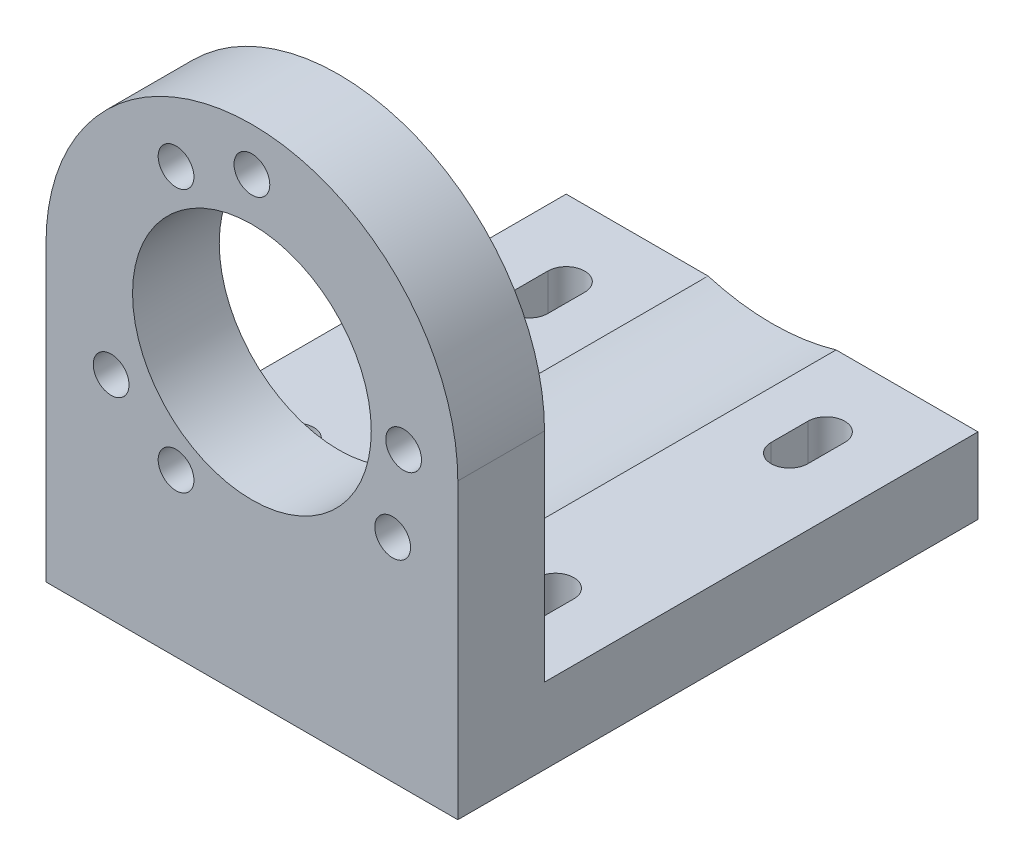
ISO-10303-21;
HEADER;
FILE_DESCRIPTION(('STEP AP214'),'2;1');
FILE_NAME('part.step','',(''),(''),'','','');
FILE_SCHEMA(('AUTOMOTIVE_DESIGN { 1 0 10303 214 1 1 1 1 }'));
ENDSEC;
DATA;
#1=APPLICATION_CONTEXT('core data for automotive mechanical design processes');
#2=APPLICATION_PROTOCOL_DEFINITION('international standard','automotive_design',2000,#1);
#3=PRODUCT_CONTEXT('',#1,'mechanical');
#4=PRODUCT('Part','Part','',(#3));
#5=PRODUCT_RELATED_PRODUCT_CATEGORY('part','',(#4));
#6=PRODUCT_DEFINITION_FORMATION('','',#4);
#7=PRODUCT_DEFINITION_CONTEXT('part definition',#1,'design');
#8=PRODUCT_DEFINITION('design','',#6,#7);
#9=PRODUCT_DEFINITION_SHAPE('','',#8);
#10=(LENGTH_UNIT() NAMED_UNIT(*) SI_UNIT(.MILLI.,.METRE.));
#11=(NAMED_UNIT(*) PLANE_ANGLE_UNIT() SI_UNIT($,.RADIAN.));
#12=(NAMED_UNIT(*) SI_UNIT($,.STERADIAN.) SOLID_ANGLE_UNIT());
#13=UNCERTAINTY_MEASURE_WITH_UNIT(LENGTH_MEASURE(1.E-05),#10,'distance_accuracy_value','');
#14=(GEOMETRIC_REPRESENTATION_CONTEXT(3) GLOBAL_UNCERTAINTY_ASSIGNED_CONTEXT((#13)) GLOBAL_UNIT_ASSIGNED_CONTEXT((#10,
#11,#12)) REPRESENTATION_CONTEXT('',''));
#15=CARTESIAN_POINT('',(0.,0.,0.));
#16=DIRECTION('',(0.,0.,1.));
#17=DIRECTION('',(1.,0.,0.));
#18=AXIS2_PLACEMENT_3D('',#15,#16,#17);
#19=CARTESIAN_POINT('',(0.,-20.0729490596628,0.));
#20=DIRECTION('',(0.,1.,0.));
#21=DIRECTION('',(0.,0.,1.));
#22=AXIS2_PLACEMENT_3D('',#19,#20,#21);
#23=PLANE('',#22);
#24=CARTESIAN_POINT('',(-12.,-20.0729490596628,-33.0063812149838));
#25=DIRECTION('',(0.,1.,0.));
#26=DIRECTION('',(0.,0.,1.));
#27=AXIS2_PLACEMENT_3D('',#24,#25,#26);
#28=CIRCLE('',#27,1.7);
#29=CARTESIAN_POINT('',(-10.3,-20.0729490596628,-33.0063812149838));
#30=VERTEX_POINT('',#29);
#31=CARTESIAN_POINT('',(-13.7,-20.0729490596628,-33.0063812149838));
#32=VERTEX_POINT('',#31);
#33=EDGE_CURVE('E55',#30,#32,#28,.T.);
#34=ORIENTED_EDGE('',*,*,#33,.F.);
#35=DIRECTION('',(0.,0.,-1.));
#36=VECTOR('',#35,1.);
#37=CARTESIAN_POINT('',(-10.3,-20.0729490596628,-33.0063812149838));
#38=LINE('',#37,#36);
#39=CARTESIAN_POINT('',(-10.3,-20.0729490596628,-29.6063812149838));
#40=VERTEX_POINT('',#39);
#41=EDGE_CURVE('E226',#40,#30,#38,.T.);
#42=ORIENTED_EDGE('',*,*,#41,.F.);
#43=CARTESIAN_POINT('',(-12.,-20.0729490596628,-29.6063812149838));
#44=DIRECTION('',(0.,1.,0.));
#45=DIRECTION('',(0.,0.,1.));
#46=AXIS2_PLACEMENT_3D('',#43,#44,#45);
#47=CIRCLE('',#46,1.7);
#48=CARTESIAN_POINT('',(-13.7,-20.0729490596628,-29.6063812149838));
#49=VERTEX_POINT('',#48);
#50=EDGE_CURVE('E208',#49,#40,#47,.T.);
#51=ORIENTED_EDGE('',*,*,#50,.F.);
#52=DIRECTION('',(0.,0.,1.));
#53=VECTOR('',#52,1.);
#54=CARTESIAN_POINT('',(-13.7,-20.0729490596628,-33.0063812149838));
#55=LINE('',#54,#53);
#56=EDGE_CURVE('E219',#32,#49,#55,.T.);
#57=ORIENTED_EDGE('',*,*,#56,.F.);
#58=EDGE_LOOP('',(#34,#42,#51,#57));
#59=FACE_BOUND('',#58,.T.);
#60=CARTESIAN_POINT('',(-12.,-20.0729490596628,-8.00638121498381));
#61=DIRECTION('',(0.,1.,0.));
#62=DIRECTION('',(0.,0.,1.));
#63=AXIS2_PLACEMENT_3D('',#60,#61,#62);
#64=CIRCLE('',#63,1.7);
#65=CARTESIAN_POINT('',(-10.3,-20.0729490596628,-8.00638121498381));
#66=VERTEX_POINT('',#65);
#67=CARTESIAN_POINT('',(-13.7,-20.0729490596628,-8.00638121498381));
#68=VERTEX_POINT('',#67);
#69=EDGE_CURVE('E63',#66,#68,#64,.T.);
#70=ORIENTED_EDGE('',*,*,#69,.F.);
#71=DIRECTION('',(0.,0.,-1.));
#72=VECTOR('',#71,1.);
#73=CARTESIAN_POINT('',(-10.3,-20.0729490596628,-8.00638121498381));
#74=LINE('',#73,#72);
#75=CARTESIAN_POINT('',(-10.3,-20.0729490596628,-4.60638121498382));
#76=VERTEX_POINT('',#75);
#77=EDGE_CURVE('E306',#76,#66,#74,.T.);
#78=ORIENTED_EDGE('',*,*,#77,.F.);
#79=CARTESIAN_POINT('',(-12.,-20.0729490596628,-4.60638121498382));
#80=DIRECTION('',(0.,1.,0.));
#81=DIRECTION('',(0.,0.,1.));
#82=AXIS2_PLACEMENT_3D('',#79,#80,#81);
#83=CIRCLE('',#82,1.7);
#84=CARTESIAN_POINT('',(-13.7,-20.0729490596628,-4.60638121498382));
#85=VERTEX_POINT('',#84);
#86=EDGE_CURVE('E302',#85,#76,#83,.T.);
#87=ORIENTED_EDGE('',*,*,#86,.F.);
#88=DIRECTION('',(0.,0.,1.));
#89=VECTOR('',#88,1.);
#90=CARTESIAN_POINT('',(-13.7,-20.0729490596628,-8.00638121498381));
#91=LINE('',#90,#89);
#92=EDGE_CURVE('E298',#68,#85,#91,.T.);
#93=ORIENTED_EDGE('',*,*,#92,.F.);
#94=EDGE_LOOP('',(#70,#78,#87,#93));
#95=FACE_BOUND('',#94,.T.);
#96=DIRECTION('',(-1.,0.,0.));
#97=VECTOR('',#96,1.);
#98=CARTESIAN_POINT('',(0.,-20.0729490596628,0.));
#99=LINE('',#98,#97);
#100=CARTESIAN_POINT('',(-5.90439898314019,-20.0729490596628,0.));
#101=VERTEX_POINT('',#100);
#102=CARTESIAN_POINT('',(-19.,-20.0729490596628,0.));
#103=VERTEX_POINT('',#102);
#104=EDGE_CURVE('E365',#101,#103,#99,.T.);
#105=ORIENTED_EDGE('',*,*,#104,.F.);
#106=DIRECTION('',(0.,0.,1.));
#107=VECTOR('',#106,1.);
#108=CARTESIAN_POINT('',(-5.90439898314019,-20.0729490596628,-51.));
#109=LINE('',#108,#107);
#110=CARTESIAN_POINT('',(-5.90439898314019,-20.0729490596628,-40.));
#111=VERTEX_POINT('',#110);
#112=EDGE_CURVE('E330',#111,#101,#109,.T.);
#113=ORIENTED_EDGE('',*,*,#112,.F.);
#114=DIRECTION('',(1.,0.,0.));
#115=VECTOR('',#114,1.);
#116=CARTESIAN_POINT('',(19.,-20.0729490596628,-40.));
#117=LINE('',#116,#115);
#118=CARTESIAN_POINT('',(-19.,-20.0729490596628,-40.));
#119=VERTEX_POINT('',#118);
#120=EDGE_CURVE('E357',#119,#111,#117,.T.);
#121=ORIENTED_EDGE('',*,*,#120,.F.);
#122=DIRECTION('',(0.,0.,-1.));
#123=VECTOR('',#122,1.);
#124=CARTESIAN_POINT('',(-19.,-20.0729490596628,8.));
#125=LINE('',#124,#123);
#126=EDGE_CURVE('E353',#103,#119,#125,.T.);
#127=ORIENTED_EDGE('',*,*,#126,.F.);
#128=EDGE_LOOP('',(#105,#113,#121,#127));
#129=FACE_BOUND('',#128,.T.);
#130=ADVANCED_FACE('F39',(#59,#95,#129),#23,.T.);
#131=CARTESIAN_POINT('',(12.,-20.0729490596628,-8.00638121498381));
#132=DIRECTION('',(0.,1.,0.));
#133=DIRECTION('',(0.,0.,1.));
#134=AXIS2_PLACEMENT_3D('',#131,#132,#133);
#135=CIRCLE('',#134,1.7);
#136=CARTESIAN_POINT('',(13.7,-20.0729490596628,-8.00638121498381));
#137=VERTEX_POINT('',#136);
#138=CARTESIAN_POINT('',(10.3,-20.0729490596628,-8.00638121498381));
#139=VERTEX_POINT('',#138);
#140=EDGE_CURVE('E269',#137,#139,#135,.T.);
#141=ORIENTED_EDGE('',*,*,#140,.F.);
#142=DIRECTION('',(0.,0.,-1.));
#143=VECTOR('',#142,1.);
#144=CARTESIAN_POINT('',(13.7,-20.0729490596628,-8.00638121498381));
#145=LINE('',#144,#143);
#146=CARTESIAN_POINT('',(13.7,-20.0729490596628,-4.60638121498382));
#147=VERTEX_POINT('',#146);
#148=EDGE_CURVE('E280',#147,#137,#145,.T.);
#149=ORIENTED_EDGE('',*,*,#148,.F.);
#150=CARTESIAN_POINT('',(12.,-20.0729490596628,-4.60638121498382));
#151=DIRECTION('',(0.,1.,0.));
#152=DIRECTION('',(0.,0.,1.));
#153=AXIS2_PLACEMENT_3D('',#150,#151,#152);
#154=CIRCLE('',#153,1.7);
#155=CARTESIAN_POINT('',(10.3,-20.0729490596628,-4.60638121498382));
#156=VERTEX_POINT('',#155);
#157=EDGE_CURVE('E276',#156,#147,#154,.T.);
#158=ORIENTED_EDGE('',*,*,#157,.F.);
#159=DIRECTION('',(0.,0.,1.));
#160=VECTOR('',#159,1.);
#161=CARTESIAN_POINT('',(10.3,-20.0729490596628,-8.00638121498381));
#162=LINE('',#161,#160);
#163=EDGE_CURVE('E272',#139,#156,#162,.T.);
#164=ORIENTED_EDGE('',*,*,#163,.F.);
#165=EDGE_LOOP('',(#141,#149,#158,#164));
#166=FACE_BOUND('',#165,.T.);
#167=CARTESIAN_POINT('',(12.,-20.0729490596628,-33.0063812149838));
#168=DIRECTION('',(0.,1.,0.));
#169=DIRECTION('',(0.,0.,1.));
#170=AXIS2_PLACEMENT_3D('',#167,#168,#169);
#171=CIRCLE('',#170,1.7);
#172=CARTESIAN_POINT('',(13.7,-20.0729490596628,-33.0063812149838));
#173=VERTEX_POINT('',#172);
#174=CARTESIAN_POINT('',(10.3,-20.0729490596628,-33.0063812149838));
#175=VERTEX_POINT('',#174);
#176=EDGE_CURVE('E240',#173,#175,#171,.T.);
#177=ORIENTED_EDGE('',*,*,#176,.F.);
#178=DIRECTION('',(0.,0.,-1.));
#179=VECTOR('',#178,1.);
#180=CARTESIAN_POINT('',(13.7,-20.0729490596628,-33.0063812149838));
#181=LINE('',#180,#179);
#182=CARTESIAN_POINT('',(13.7,-20.0729490596628,-29.6063812149838));
#183=VERTEX_POINT('',#182);
#184=EDGE_CURVE('E252',#183,#173,#181,.T.);
#185=ORIENTED_EDGE('',*,*,#184,.F.);
#186=CARTESIAN_POINT('',(12.,-20.0729490596628,-29.6063812149838));
#187=DIRECTION('',(0.,1.,0.));
#188=DIRECTION('',(0.,0.,1.));
#189=AXIS2_PLACEMENT_3D('',#186,#187,#188);
#190=CIRCLE('',#189,1.7);
#191=CARTESIAN_POINT('',(10.3,-20.0729490596628,-29.6063812149838));
#192=VERTEX_POINT('',#191);
#193=EDGE_CURVE('E248',#192,#183,#190,.T.);
#194=ORIENTED_EDGE('',*,*,#193,.F.);
#195=DIRECTION('',(0.,0.,1.));
#196=VECTOR('',#195,1.);
#197=CARTESIAN_POINT('',(10.3,-20.0729490596628,-33.0063812149838));
#198=LINE('',#197,#196);
#199=EDGE_CURVE('E243',#175,#192,#198,.T.);
#200=ORIENTED_EDGE('',*,*,#199,.F.);
#201=EDGE_LOOP('',(#177,#185,#194,#200));
#202=FACE_BOUND('',#201,.T.);
#203=CARTESIAN_POINT('',(5.90439898314019,-20.0729490596628,-40.));
#204=VERTEX_POINT('',#203);
#205=CARTESIAN_POINT('',(19.,-20.0729490596628,-40.));
#206=VERTEX_POINT('',#205);
#207=EDGE_CURVE('E356',#204,#206,#117,.T.);
#208=ORIENTED_EDGE('',*,*,#207,.F.);
#209=DIRECTION('',(0.,0.,1.));
#210=VECTOR('',#209,1.);
#211=CARTESIAN_POINT('',(5.90439898314019,-20.0729490596628,-51.));
#212=LINE('',#211,#210);
#213=CARTESIAN_POINT('',(5.90439898314019,-20.0729490596628,0.));
#214=VERTEX_POINT('',#213);
#215=EDGE_CURVE('E326',#204,#214,#212,.T.);
#216=ORIENTED_EDGE('',*,*,#215,.T.);
#217=CARTESIAN_POINT('',(19.,-20.0729490596628,0.));
#218=VERTEX_POINT('',#217);
#219=EDGE_CURVE('E368',#218,#214,#99,.T.);
#220=ORIENTED_EDGE('',*,*,#219,.F.);
#221=DIRECTION('',(0.,0.,1.));
#222=VECTOR('',#221,1.);
#223=CARTESIAN_POINT('',(19.,-20.0729490596628,8.));
#224=LINE('',#223,#222);
#225=EDGE_CURVE('E349',#206,#218,#224,.T.);
#226=ORIENTED_EDGE('',*,*,#225,.F.);
#227=EDGE_LOOP('',(#208,#216,#220,#226));
#228=FACE_BOUND('',#227,.T.);
#229=ADVANCED_FACE('F530',(#166,#202,#228),#23,.T.);
#230=CARTESIAN_POINT('',(19.,-20.0729490596628,-40.));
#231=DIRECTION('',(0.,0.,-1.));
#232=DIRECTION('',(-1.,0.,0.));
#233=AXIS2_PLACEMENT_3D('',#230,#231,#232);
#234=PLANE('',#233);
#235=ORIENTED_EDGE('',*,*,#120,.T.);
#236=CARTESIAN_POINT('',(0.,0.,-40.));
#237=DIRECTION('',(0.,0.,-1.));
#238=DIRECTION('',(-1.,0.,0.));
#239=AXIS2_PLACEMENT_3D('',#236,#237,#238);
#240=CIRCLE('',#239,20.9233174067575);
#241=EDGE_CURVE('E457',#111,#204,#240,.F.);
#242=ORIENTED_EDGE('',*,*,#241,.T.);
#243=ORIENTED_EDGE('',*,*,#207,.T.);
#244=DIRECTION('',(0.,-1.,0.));
#245=VECTOR('',#244,1.);
#246=CARTESIAN_POINT('',(19.,-20.0729490596628,-40.));
#247=LINE('',#246,#245);
#248=CARTESIAN_POINT('',(19.,-27.0729490596628,-40.));
#249=VERTEX_POINT('',#248);
#250=EDGE_CURVE('E362',#206,#249,#247,.T.);
#251=ORIENTED_EDGE('',*,*,#250,.T.);
#252=DIRECTION('',(1.,0.,0.));
#253=VECTOR('',#252,1.);
#254=CARTESIAN_POINT('',(19.,-27.0729490596628,-40.));
#255=LINE('',#254,#253);
#256=CARTESIAN_POINT('',(-19.,-27.0729490596628,-40.));
#257=VERTEX_POINT('',#256);
#258=EDGE_CURVE('E345',#257,#249,#255,.T.);
#259=ORIENTED_EDGE('',*,*,#258,.F.);
#260=DIRECTION('',(0.,-1.,0.));
#261=VECTOR('',#260,1.);
#262=CARTESIAN_POINT('',(-19.,-20.0729490596628,-40.));
#263=LINE('',#262,#261);
#264=EDGE_CURVE('E361',#119,#257,#263,.T.);
#265=ORIENTED_EDGE('',*,*,#264,.F.);
#266=EDGE_LOOP('',(#235,#242,#243,#251,#259,#265));
#267=FACE_BOUND('',#266,.T.);
#268=ADVANCED_FACE('F550',(#267),#234,.T.);
#269=CARTESIAN_POINT('',(0.,0.,8.));
#270=DIRECTION('',(0.,0.,1.));
#271=DIRECTION('',(1.,0.,0.));
#272=AXIS2_PLACEMENT_3D('',#269,#270,#271);
#273=PLANE('',#272);
#274=DIRECTION('',(0.,-1.,0.));
#275=VECTOR('',#274,1.);
#276=CARTESIAN_POINT('',(-19.,0.,8.));
#277=LINE('',#276,#275);
#278=CARTESIAN_POINT('',(-19.,0.,8.));
#279=VERTEX_POINT('',#278);
#280=CARTESIAN_POINT('',(-19.,-27.0729490596628,8.));
#281=VERTEX_POINT('',#280);
#282=EDGE_CURVE('E433',#279,#281,#277,.T.);
#283=ORIENTED_EDGE('',*,*,#282,.T.);
#284=DIRECTION('',(-1.,0.,0.));
#285=VECTOR('',#284,1.);
#286=CARTESIAN_POINT('',(19.,-27.0729490596628,8.));
#287=LINE('',#286,#285);
#288=CARTESIAN_POINT('',(19.,-27.0729490596628,8.));
#289=VERTEX_POINT('',#288);
#290=EDGE_CURVE('E337',#289,#281,#287,.T.);
#291=ORIENTED_EDGE('',*,*,#290,.F.);
#292=DIRECTION('',(0.,1.,0.));
#293=VECTOR('',#292,1.);
#294=CARTESIAN_POINT('',(19.,0.,8.));
#295=LINE('',#294,#293);
#296=CARTESIAN_POINT('',(19.,0.,8.));
#297=VERTEX_POINT('',#296);
#298=EDGE_CURVE('E437',#289,#297,#295,.T.);
#299=ORIENTED_EDGE('',*,*,#298,.T.);
#300=CARTESIAN_POINT('',(0.,0.,8.));
#301=DIRECTION('',(0.,0.,1.));
#302=DIRECTION('',(1.,0.,0.));
#303=AXIS2_PLACEMENT_3D('',#300,#301,#302);
#304=CIRCLE('',#303,19.);
#305=EDGE_CURVE('E429',#297,#279,#304,.T.);
#306=ORIENTED_EDGE('',*,*,#305,.T.);
#307=EDGE_LOOP('',(#283,#291,#299,#306));
#308=FACE_BOUND('',#307,.T.);
#309=CARTESIAN_POINT('',(0.,15.,8.));
#310=DIRECTION('',(0.,0.,1.));
#311=DIRECTION('',(1.,0.,0.));
#312=AXIS2_PLACEMENT_3D('',#309,#310,#311);
#313=CIRCLE('',#312,1.65);
#314=CARTESIAN_POINT('',(1.65,15.,8.));
#315=VERTEX_POINT('',#314);
#316=EDGE_CURVE('E381',#315,#315,#313,.T.);
#317=ORIENTED_EDGE('',*,*,#316,.F.);
#318=EDGE_LOOP('',(#317));
#319=FACE_BOUND('',#318,.T.);
#320=CARTESIAN_POINT('',(12.9903810567656,-7.50000000000172,8.));
#321=DIRECTION('',(0.,0.,1.));
#322=DIRECTION('',(1.,0.,0.));
#323=AXIS2_PLACEMENT_3D('',#320,#321,#322);
#324=CIRCLE('',#323,1.65);
#325=CARTESIAN_POINT('',(14.6403810567656,-7.50000000000172,8.));
#326=VERTEX_POINT('',#325);
#327=EDGE_CURVE('E397',#326,#326,#324,.T.);
#328=ORIENTED_EDGE('',*,*,#327,.F.);
#329=EDGE_LOOP('',(#328));
#330=FACE_BOUND('',#329,.T.);
#331=CARTESIAN_POINT('',(-7.00000000000088,-12.1243556529811,8.));
#332=DIRECTION('',(0.,0.,1.));
#333=DIRECTION('',(1.,0.,0.));
#334=AXIS2_PLACEMENT_3D('',#331,#332,#333);
#335=CIRCLE('',#334,1.64999999999999);
#336=CARTESIAN_POINT('',(-5.35000000000089,-12.1243556529811,8.));
#337=VERTEX_POINT('',#336);
#338=EDGE_CURVE('E413',#337,#337,#335,.T.);
#339=ORIENTED_EDGE('',*,*,#338,.F.);
#340=EDGE_LOOP('',(#339));
#341=FACE_BOUND('',#340,.T.);
#342=CARTESIAN_POINT('',(-12.9903810567686,-7.49999999999657,8.));
#343=DIRECTION('',(0.,0.,1.));
#344=DIRECTION('',(1.,0.,0.));
#345=AXIS2_PLACEMENT_3D('',#342,#343,#344);
#346=CIRCLE('',#345,1.65);
#347=CARTESIAN_POINT('',(-11.3403810567686,-7.49999999999657,8.));
#348=VERTEX_POINT('',#347);
#349=EDGE_CURVE('E421',#348,#348,#346,.T.);
#350=ORIENTED_EDGE('',*,*,#349,.F.);
#351=EDGE_LOOP('',(#350));
#352=FACE_BOUND('',#351,.T.);
#353=CARTESIAN_POINT('',(0.,0.,8.));
#354=DIRECTION('',(0.,0.,1.));
#355=DIRECTION('',(1.,0.,0.));
#356=AXIS2_PLACEMENT_3D('',#353,#354,#355);
#357=CIRCLE('',#356,11.0138861910663);
#358=CARTESIAN_POINT('',(11.0138861910663,0.,8.));
#359=VERTEX_POINT('',#358);
#360=EDGE_CURVE('E405',#359,#359,#357,.T.);
#361=ORIENTED_EDGE('',*,*,#360,.F.);
#362=EDGE_LOOP('',(#361));
#363=FACE_BOUND('',#362,.T.);
#364=CARTESIAN_POINT('',(14.0000000000009,-2.67147415300428E-13,8.));
#365=DIRECTION('',(0.,0.,1.));
#366=DIRECTION('',(1.,0.,0.));
#367=AXIS2_PLACEMENT_3D('',#364,#365,#366);
#368=CIRCLE('',#367,1.65);
#369=CARTESIAN_POINT('',(15.6500000000009,-2.67147415300428E-13,8.));
#370=VERTEX_POINT('',#369);
#371=EDGE_CURVE('E389',#370,#370,#368,.T.);
#372=ORIENTED_EDGE('',*,*,#371,.F.);
#373=EDGE_LOOP('',(#372));
#374=FACE_BOUND('',#373,.T.);
#375=CARTESIAN_POINT('',(-7.,12.1243556529822,8.));
#376=DIRECTION('',(0.,0.,1.));
#377=DIRECTION('',(1.,0.,0.));
#378=AXIS2_PLACEMENT_3D('',#375,#376,#377);
#379=CIRCLE('',#378,1.65000000000004);
#380=CARTESIAN_POINT('',(-5.34999999999997,12.1243556529822,8.));
#381=VERTEX_POINT('',#380);
#382=EDGE_CURVE('E373',#381,#381,#379,.T.);
#383=ORIENTED_EDGE('',*,*,#382,.F.);
#384=EDGE_LOOP('',(#383));
#385=FACE_BOUND('',#384,.T.);
#386=ADVANCED_FACE('F556',(#308,#319,#330,#341,#352,#363,#374,#385),#273,.T.);
#387=CARTESIAN_POINT('',(0.,0.,0.));
#388=DIRECTION('',(0.,0.,1.));
#389=DIRECTION('',(1.,0.,0.));
#390=AXIS2_PLACEMENT_3D('',#387,#388,#389);
#391=PLANE('',#390);
#392=DIRECTION('',(0.,1.,0.));
#393=VECTOR('',#392,1.);
#394=CARTESIAN_POINT('',(19.,0.,0.));
#395=LINE('',#394,#393);
#396=CARTESIAN_POINT('',(19.,0.,0.));
#397=VERTEX_POINT('',#396);
#398=EDGE_CURVE('E434',#218,#397,#395,.T.);
#399=ORIENTED_EDGE('',*,*,#398,.F.);
#400=ORIENTED_EDGE('',*,*,#219,.T.);
#401=CARTESIAN_POINT('',(0.,0.,0.));
#402=DIRECTION('',(0.,0.,-1.));
#403=DIRECTION('',(-1.,0.,0.));
#404=AXIS2_PLACEMENT_3D('',#401,#402,#403);
#405=CIRCLE('',#404,20.9233174067575);
#406=EDGE_CURVE('E314',#214,#101,#405,.T.);
#407=ORIENTED_EDGE('',*,*,#406,.T.);
#408=ORIENTED_EDGE('',*,*,#104,.T.);
#409=DIRECTION('',(0.,-1.,0.));
#410=VECTOR('',#409,1.);
#411=CARTESIAN_POINT('',(-19.,0.,0.));
#412=LINE('',#411,#410);
#413=CARTESIAN_POINT('',(-19.,0.,0.));
#414=VERTEX_POINT('',#413);
#415=EDGE_CURVE('E444',#414,#103,#412,.T.);
#416=ORIENTED_EDGE('',*,*,#415,.F.);
#417=CARTESIAN_POINT('',(0.,0.,0.));
#418=DIRECTION('',(0.,0.,1.));
#419=DIRECTION('',(1.,0.,0.));
#420=AXIS2_PLACEMENT_3D('',#417,#418,#419);
#421=CIRCLE('',#420,19.);
#422=EDGE_CURVE('E425',#397,#414,#421,.T.);
#423=ORIENTED_EDGE('',*,*,#422,.F.);
#424=EDGE_LOOP('',(#399,#400,#407,#408,#416,#423));
#425=FACE_BOUND('',#424,.T.);
#426=CARTESIAN_POINT('',(-12.9903810567686,-7.49999999999657,0.));
#427=DIRECTION('',(0.,0.,1.));
#428=DIRECTION('',(1.,0.,0.));
#429=AXIS2_PLACEMENT_3D('',#426,#427,#428);
#430=CIRCLE('',#429,1.65);
#431=CARTESIAN_POINT('',(-11.3403810567686,-7.49999999999657,0.));
#432=VERTEX_POINT('',#431);
#433=EDGE_CURVE('E417',#432,#432,#430,.T.);
#434=ORIENTED_EDGE('',*,*,#433,.T.);
#435=EDGE_LOOP('',(#434));
#436=FACE_BOUND('',#435,.T.);
#437=CARTESIAN_POINT('',(-7.00000000000088,-12.1243556529811,0.));
#438=DIRECTION('',(0.,0.,1.));
#439=DIRECTION('',(1.,0.,0.));
#440=AXIS2_PLACEMENT_3D('',#437,#438,#439);
#441=CIRCLE('',#440,1.64999999999999);
#442=CARTESIAN_POINT('',(-5.35000000000089,-12.1243556529811,0.));
#443=VERTEX_POINT('',#442);
#444=EDGE_CURVE('E409',#443,#443,#441,.T.);
#445=ORIENTED_EDGE('',*,*,#444,.T.);
#446=EDGE_LOOP('',(#445));
#447=FACE_BOUND('',#446,.T.);
#448=CARTESIAN_POINT('',(0.,0.,0.));
#449=DIRECTION('',(0.,0.,1.));
#450=DIRECTION('',(1.,0.,0.));
#451=AXIS2_PLACEMENT_3D('',#448,#449,#450);
#452=CIRCLE('',#451,11.0138861910663);
#453=CARTESIAN_POINT('',(11.0138861910663,0.,0.));
#454=VERTEX_POINT('',#453);
#455=EDGE_CURVE('E401',#454,#454,#452,.T.);
#456=ORIENTED_EDGE('',*,*,#455,.T.);
#457=EDGE_LOOP('',(#456));
#458=FACE_BOUND('',#457,.T.);
#459=CARTESIAN_POINT('',(12.9903810567656,-7.50000000000172,0.));
#460=DIRECTION('',(0.,0.,1.));
#461=DIRECTION('',(1.,0.,0.));
#462=AXIS2_PLACEMENT_3D('',#459,#460,#461);
#463=CIRCLE('',#462,1.65);
#464=CARTESIAN_POINT('',(14.6403810567656,-7.50000000000172,0.));
#465=VERTEX_POINT('',#464);
#466=EDGE_CURVE('E393',#465,#465,#463,.T.);
#467=ORIENTED_EDGE('',*,*,#466,.T.);
#468=EDGE_LOOP('',(#467));
#469=FACE_BOUND('',#468,.T.);
#470=CARTESIAN_POINT('',(14.0000000000009,-2.67147415300428E-13,0.));
#471=DIRECTION('',(0.,0.,1.));
#472=DIRECTION('',(1.,0.,0.));
#473=AXIS2_PLACEMENT_3D('',#470,#471,#472);
#474=CIRCLE('',#473,1.65);
#475=CARTESIAN_POINT('',(15.6500000000009,-2.67147415300428E-13,0.));
#476=VERTEX_POINT('',#475);
#477=EDGE_CURVE('E385',#476,#476,#474,.T.);
#478=ORIENTED_EDGE('',*,*,#477,.T.);
#479=EDGE_LOOP('',(#478));
#480=FACE_BOUND('',#479,.T.);
#481=CARTESIAN_POINT('',(0.,15.,0.));
#482=DIRECTION('',(0.,0.,1.));
#483=DIRECTION('',(1.,0.,0.));
#484=AXIS2_PLACEMENT_3D('',#481,#482,#483);
#485=CIRCLE('',#484,1.65);
#486=CARTESIAN_POINT('',(1.65,15.,0.));
#487=VERTEX_POINT('',#486);
#488=EDGE_CURVE('E377',#487,#487,#485,.T.);
#489=ORIENTED_EDGE('',*,*,#488,.T.);
#490=EDGE_LOOP('',(#489));
#491=FACE_BOUND('',#490,.T.);
#492=CARTESIAN_POINT('',(-7.,12.1243556529822,0.));
#493=DIRECTION('',(0.,0.,1.));
#494=DIRECTION('',(1.,0.,0.));
#495=AXIS2_PLACEMENT_3D('',#492,#493,#494);
#496=CIRCLE('',#495,1.65000000000004);
#497=CARTESIAN_POINT('',(-5.34999999999997,12.1243556529822,0.));
#498=VERTEX_POINT('',#497);
#499=EDGE_CURVE('E372',#498,#498,#496,.T.);
#500=ORIENTED_EDGE('',*,*,#499,.T.);
#501=EDGE_LOOP('',(#500));
#502=FACE_BOUND('',#501,.T.);
#503=ADVANCED_FACE('F588',(#425,#436,#447,#458,#469,#480,#491,#502),#391,.F.);
#504=CARTESIAN_POINT('',(0.,0.,8.));
#505=DIRECTION('',(0.,0.,-1.));
#506=DIRECTION('',(-1.,0.,0.));
#507=AXIS2_PLACEMENT_3D('',#504,#505,#506);
#508=CYLINDRICAL_SURFACE('',#507,19.);
#509=ORIENTED_EDGE('',*,*,#422,.T.);
#510=DIRECTION('',(0.,0.,-1.));
#511=VECTOR('',#510,1.);
#512=CARTESIAN_POINT('',(-19.,0.,8.));
#513=LINE('',#512,#511);
#514=EDGE_CURVE('E453',#279,#414,#513,.T.);
#515=ORIENTED_EDGE('',*,*,#514,.F.);
#516=ORIENTED_EDGE('',*,*,#305,.F.);
#517=DIRECTION('',(0.,0.,-1.));
#518=VECTOR('',#517,1.);
#519=CARTESIAN_POINT('',(19.,0.,8.));
#520=LINE('',#519,#518);
#521=EDGE_CURVE('E440',#297,#397,#520,.T.);
#522=ORIENTED_EDGE('',*,*,#521,.T.);
#523=EDGE_LOOP('',(#509,#515,#516,#522));
#524=FACE_BOUND('',#523,.T.);
#525=ADVANCED_FACE('F41',(#524),#508,.T.);
#526=CARTESIAN_POINT('',(-19.,0.,8.));
#527=DIRECTION('',(1.,0.,0.));
#528=DIRECTION('',(0.,1.,0.));
#529=AXIS2_PLACEMENT_3D('',#526,#527,#528);
#530=PLANE('',#529);
#531=ORIENTED_EDGE('',*,*,#415,.T.);
#532=ORIENTED_EDGE('',*,*,#126,.T.);
#533=ORIENTED_EDGE('',*,*,#264,.T.);
#534=DIRECTION('',(0.,0.,-1.));
#535=VECTOR('',#534,1.);
#536=CARTESIAN_POINT('',(-19.,-27.0729490596628,8.));
#537=LINE('',#536,#535);
#538=EDGE_CURVE('E341',#281,#257,#537,.T.);
#539=ORIENTED_EDGE('',*,*,#538,.F.);
#540=ORIENTED_EDGE('',*,*,#282,.F.);
#541=ORIENTED_EDGE('',*,*,#514,.T.);
#542=EDGE_LOOP('',(#531,#532,#533,#539,#540,#541));
#543=FACE_BOUND('',#542,.T.);
#544=ADVANCED_FACE('F594',(#543),#530,.F.);
#545=CARTESIAN_POINT('',(19.,0.,8.));
#546=DIRECTION('',(-1.,0.,0.));
#547=DIRECTION('',(0.,-1.,0.));
#548=AXIS2_PLACEMENT_3D('',#545,#546,#547);
#549=PLANE('',#548);
#550=ORIENTED_EDGE('',*,*,#225,.T.);
#551=ORIENTED_EDGE('',*,*,#398,.T.);
#552=ORIENTED_EDGE('',*,*,#521,.F.);
#553=ORIENTED_EDGE('',*,*,#298,.F.);
#554=DIRECTION('',(0.,0.,1.));
#555=VECTOR('',#554,1.);
#556=CARTESIAN_POINT('',(19.,-27.0729490596628,8.));
#557=LINE('',#556,#555);
#558=EDGE_CURVE('E333',#249,#289,#557,.T.);
#559=ORIENTED_EDGE('',*,*,#558,.F.);
#560=ORIENTED_EDGE('',*,*,#250,.F.);
#561=EDGE_LOOP('',(#550,#551,#552,#553,#559,#560));
#562=FACE_BOUND('',#561,.T.);
#563=ADVANCED_FACE('F584',(#562),#549,.F.);
#564=CARTESIAN_POINT('',(-12.9903810567686,-7.49999999999657,8.));
#565=DIRECTION('',(0.,0.,-1.));
#566=DIRECTION('',(-1.,0.,0.));
#567=AXIS2_PLACEMENT_3D('',#564,#565,#566);
#568=CYLINDRICAL_SURFACE('',#567,1.65);
#569=ORIENTED_EDGE('',*,*,#433,.F.);
#570=EDGE_LOOP('',(#569));
#571=FACE_BOUND('',#570,.T.);
#572=ORIENTED_EDGE('',*,*,#349,.T.);
#573=EDGE_LOOP('',(#572));
#574=FACE_BOUND('',#573,.T.);
#575=ADVANCED_FACE('F580',(#571,#574),#568,.F.);
#576=CARTESIAN_POINT('',(-7.00000000000088,-12.1243556529811,8.));
#577=DIRECTION('',(0.,0.,-1.));
#578=DIRECTION('',(-1.,0.,0.));
#579=AXIS2_PLACEMENT_3D('',#576,#577,#578);
#580=CYLINDRICAL_SURFACE('',#579,1.64999999999999);
#581=ORIENTED_EDGE('',*,*,#444,.F.);
#582=EDGE_LOOP('',(#581));
#583=FACE_BOUND('',#582,.T.);
#584=ORIENTED_EDGE('',*,*,#338,.T.);
#585=EDGE_LOOP('',(#584));
#586=FACE_BOUND('',#585,.T.);
#587=ADVANCED_FACE('F576',(#583,#586),#580,.F.);
#588=CARTESIAN_POINT('',(0.,0.,8.));
#589=DIRECTION('',(0.,0.,-1.));
#590=DIRECTION('',(-1.,0.,0.));
#591=AXIS2_PLACEMENT_3D('',#588,#589,#590);
#592=CYLINDRICAL_SURFACE('',#591,11.0138861910663);
#593=ORIENTED_EDGE('',*,*,#360,.T.);
#594=EDGE_LOOP('',(#593));
#595=FACE_BOUND('',#594,.T.);
#596=ORIENTED_EDGE('',*,*,#455,.F.);
#597=EDGE_LOOP('',(#596));
#598=FACE_BOUND('',#597,.T.);
#599=ADVANCED_FACE('F572',(#595,#598),#592,.F.);
#600=CARTESIAN_POINT('',(12.9903810567656,-7.50000000000172,8.));
#601=DIRECTION('',(0.,0.,-1.));
#602=DIRECTION('',(-1.,0.,0.));
#603=AXIS2_PLACEMENT_3D('',#600,#601,#602);
#604=CYLINDRICAL_SURFACE('',#603,1.65);
#605=ORIENTED_EDGE('',*,*,#466,.F.);
#606=EDGE_LOOP('',(#605));
#607=FACE_BOUND('',#606,.T.);
#608=ORIENTED_EDGE('',*,*,#327,.T.);
#609=EDGE_LOOP('',(#608));
#610=FACE_BOUND('',#609,.T.);
#611=ADVANCED_FACE('F568',(#607,#610),#604,.F.);
#612=CARTESIAN_POINT('',(14.0000000000009,-2.67147415300428E-13,8.));
#613=DIRECTION('',(0.,0.,-1.));
#614=DIRECTION('',(-1.,0.,0.));
#615=AXIS2_PLACEMENT_3D('',#612,#613,#614);
#616=CYLINDRICAL_SURFACE('',#615,1.65);
#617=ORIENTED_EDGE('',*,*,#477,.F.);
#618=EDGE_LOOP('',(#617));
#619=FACE_BOUND('',#618,.T.);
#620=ORIENTED_EDGE('',*,*,#371,.T.);
#621=EDGE_LOOP('',(#620));
#622=FACE_BOUND('',#621,.T.);
#623=ADVANCED_FACE('F564',(#619,#622),#616,.F.);
#624=CARTESIAN_POINT('',(0.,15.,8.));
#625=DIRECTION('',(0.,0.,-1.));
#626=DIRECTION('',(-1.,0.,0.));
#627=AXIS2_PLACEMENT_3D('',#624,#625,#626);
#628=CYLINDRICAL_SURFACE('',#627,1.65);
#629=ORIENTED_EDGE('',*,*,#488,.F.);
#630=EDGE_LOOP('',(#629));
#631=FACE_BOUND('',#630,.T.);
#632=ORIENTED_EDGE('',*,*,#316,.T.);
#633=EDGE_LOOP('',(#632));
#634=FACE_BOUND('',#633,.T.);
#635=ADVANCED_FACE('F560',(#631,#634),#628,.F.);
#636=CARTESIAN_POINT('',(-7.,12.1243556529822,8.));
#637=DIRECTION('',(0.,0.,-1.));
#638=DIRECTION('',(-1.,0.,0.));
#639=AXIS2_PLACEMENT_3D('',#636,#637,#638);
#640=CYLINDRICAL_SURFACE('',#639,1.65000000000004);
#641=ORIENTED_EDGE('',*,*,#499,.F.);
#642=EDGE_LOOP('',(#641));
#643=FACE_BOUND('',#642,.T.);
#644=ORIENTED_EDGE('',*,*,#382,.T.);
#645=EDGE_LOOP('',(#644));
#646=FACE_BOUND('',#645,.T.);
#647=ADVANCED_FACE('F558',(#643,#646),#640,.F.);
#648=CARTESIAN_POINT('',(0.,-27.0729490596628,0.));
#649=DIRECTION('',(0.,1.,0.));
#650=DIRECTION('',(0.,0.,1.));
#651=AXIS2_PLACEMENT_3D('',#648,#649,#650);
#652=PLANE('',#651);
#653=DIRECTION('',(0.,0.,-1.));
#654=VECTOR('',#653,1.);
#655=CARTESIAN_POINT('',(13.7,-27.0729490596628,0.));
#656=LINE('',#655,#654);
#657=CARTESIAN_POINT('',(13.7,-27.0729490596628,-4.60638121498382));
#658=VERTEX_POINT('',#657);
#659=CARTESIAN_POINT('',(13.7,-27.0729490596628,-8.00638121498381));
#660=VERTEX_POINT('',#659);
#661=EDGE_CURVE('E48',#658,#660,#656,.T.);
#662=ORIENTED_EDGE('',*,*,#661,.T.);
#663=CARTESIAN_POINT('',(12.,-27.0729490596628,-8.00638121498381));
#664=DIRECTION('',(0.,1.,0.));
#665=DIRECTION('',(0.,0.,1.));
#666=AXIS2_PLACEMENT_3D('',#663,#664,#665);
#667=CIRCLE('',#666,1.7);
#668=CARTESIAN_POINT('',(10.3,-27.0729490596628,-8.00638121498381));
#669=VERTEX_POINT('',#668);
#670=EDGE_CURVE('E11',#660,#669,#667,.T.);
#671=ORIENTED_EDGE('',*,*,#670,.T.);
#672=DIRECTION('',(0.,0.,1.));
#673=VECTOR('',#672,1.);
#674=CARTESIAN_POINT('',(10.3,-27.0729490596628,0.));
#675=LINE('',#674,#673);
#676=CARTESIAN_POINT('',(10.3,-27.0729490596628,-4.60638121498382));
#677=VERTEX_POINT('',#676);
#678=EDGE_CURVE('E506',#669,#677,#675,.T.);
#679=ORIENTED_EDGE('',*,*,#678,.T.);
#680=CARTESIAN_POINT('',(12.,-27.0729490596628,-4.60638121498382));
#681=DIRECTION('',(0.,1.,0.));
#682=DIRECTION('',(0.,0.,1.));
#683=AXIS2_PLACEMENT_3D('',#680,#681,#682);
#684=CIRCLE('',#683,1.7);
#685=EDGE_CURVE('E510',#677,#658,#684,.T.);
#686=ORIENTED_EDGE('',*,*,#685,.T.);
#687=EDGE_LOOP('',(#662,#671,#679,#686));
#688=FACE_BOUND('',#687,.T.);
#689=DIRECTION('',(0.,0.,-1.));
#690=VECTOR('',#689,1.);
#691=CARTESIAN_POINT('',(13.7,-27.0729490596628,0.));
#692=LINE('',#691,#690);
#693=CARTESIAN_POINT('',(13.7,-27.0729490596628,-29.6063812149838));
#694=VERTEX_POINT('',#693);
#695=CARTESIAN_POINT('',(13.7,-27.0729490596628,-33.0063812149838));
#696=VERTEX_POINT('',#695);
#697=EDGE_CURVE('E498',#694,#696,#692,.T.);
#698=ORIENTED_EDGE('',*,*,#697,.T.);
#699=CARTESIAN_POINT('',(12.,-27.0729490596628,-33.0063812149838));
#700=DIRECTION('',(0.,1.,0.));
#701=DIRECTION('',(0.,0.,1.));
#702=AXIS2_PLACEMENT_3D('',#699,#700,#701);
#703=CIRCLE('',#702,1.7);
#704=CARTESIAN_POINT('',(10.3,-27.0729490596628,-33.0063812149838));
#705=VERTEX_POINT('',#704);
#706=EDGE_CURVE('E502',#696,#705,#703,.T.);
#707=ORIENTED_EDGE('',*,*,#706,.T.);
#708=DIRECTION('',(0.,0.,1.));
#709=VECTOR('',#708,1.);
#710=CARTESIAN_POINT('',(10.3,-27.0729490596628,0.));
#711=LINE('',#710,#709);
#712=CARTESIAN_POINT('',(10.3,-27.0729490596628,-29.6063812149838));
#713=VERTEX_POINT('',#712);
#714=EDGE_CURVE('E490',#705,#713,#711,.T.);
#715=ORIENTED_EDGE('',*,*,#714,.T.);
#716=CARTESIAN_POINT('',(12.,-27.0729490596628,-29.6063812149838));
#717=DIRECTION('',(0.,1.,0.));
#718=DIRECTION('',(0.,0.,1.));
#719=AXIS2_PLACEMENT_3D('',#716,#717,#718);
#720=CIRCLE('',#719,1.7);
#721=EDGE_CURVE('E494',#713,#694,#720,.T.);
#722=ORIENTED_EDGE('',*,*,#721,.T.);
#723=EDGE_LOOP('',(#698,#707,#715,#722));
#724=FACE_BOUND('',#723,.T.);
#725=DIRECTION('',(0.,0.,-1.));
#726=VECTOR('',#725,1.);
#727=CARTESIAN_POINT('',(-10.3,-27.0729490596628,0.));
#728=LINE('',#727,#726);
#729=CARTESIAN_POINT('',(-10.3,-27.0729490596628,-29.6063812149838));
#730=VERTEX_POINT('',#729);
#731=CARTESIAN_POINT('',(-10.3,-27.0729490596628,-33.0063812149838));
#732=VERTEX_POINT('',#731);
#733=EDGE_CURVE('E482',#730,#732,#728,.T.);
#734=ORIENTED_EDGE('',*,*,#733,.T.);
#735=CARTESIAN_POINT('',(-12.,-27.0729490596628,-33.0063812149838));
#736=DIRECTION('',(0.,1.,0.));
#737=DIRECTION('',(0.,0.,1.));
#738=AXIS2_PLACEMENT_3D('',#735,#736,#737);
#739=CIRCLE('',#738,1.7);
#740=CARTESIAN_POINT('',(-13.7,-27.0729490596628,-33.0063812149838));
#741=VERTEX_POINT('',#740);
#742=EDGE_CURVE('E486',#732,#741,#739,.T.);
#743=ORIENTED_EDGE('',*,*,#742,.T.);
#744=DIRECTION('',(0.,0.,1.));
#745=VECTOR('',#744,1.);
#746=CARTESIAN_POINT('',(-13.7,-27.0729490596628,0.));
#747=LINE('',#746,#745);
#748=CARTESIAN_POINT('',(-13.7,-27.0729490596628,-29.6063812149838));
#749=VERTEX_POINT('',#748);
#750=EDGE_CURVE('E477',#741,#749,#747,.T.);
#751=ORIENTED_EDGE('',*,*,#750,.T.);
#752=CARTESIAN_POINT('',(-12.,-27.0729490596628,-29.6063812149838));
#753=DIRECTION('',(0.,1.,0.));
#754=DIRECTION('',(0.,0.,1.));
#755=AXIS2_PLACEMENT_3D('',#752,#753,#754);
#756=CIRCLE('',#755,1.7);
#757=EDGE_CURVE('E211',#749,#730,#756,.T.);
#758=ORIENTED_EDGE('',*,*,#757,.T.);
#759=EDGE_LOOP('',(#734,#743,#751,#758));
#760=FACE_BOUND('',#759,.T.);
#761=DIRECTION('',(0.,0.,-1.));
#762=VECTOR('',#761,1.);
#763=CARTESIAN_POINT('',(-10.3,-27.0729490596628,0.));
#764=LINE('',#763,#762);
#765=CARTESIAN_POINT('',(-10.3,-27.0729490596628,-4.60638121498382));
#766=VERTEX_POINT('',#765);
#767=CARTESIAN_POINT('',(-10.3,-27.0729490596628,-8.00638121498381));
#768=VERTEX_POINT('',#767);
#769=EDGE_CURVE('E469',#766,#768,#764,.T.);
#770=ORIENTED_EDGE('',*,*,#769,.T.);
#771=CARTESIAN_POINT('',(-12.,-27.0729490596628,-8.00638121498381));
#772=DIRECTION('',(0.,1.,0.));
#773=DIRECTION('',(0.,0.,1.));
#774=AXIS2_PLACEMENT_3D('',#771,#772,#773);
#775=CIRCLE('',#774,1.7);
#776=CARTESIAN_POINT('',(-13.7,-27.0729490596628,-8.00638121498381));
#777=VERTEX_POINT('',#776);
#778=EDGE_CURVE('E473',#768,#777,#775,.T.);
#779=ORIENTED_EDGE('',*,*,#778,.T.);
#780=DIRECTION('',(0.,0.,1.));
#781=VECTOR('',#780,1.);
#782=CARTESIAN_POINT('',(-13.7,-27.0729490596628,0.));
#783=LINE('',#782,#781);
#784=CARTESIAN_POINT('',(-13.7,-27.0729490596628,-4.60638121498382));
#785=VERTEX_POINT('',#784);
#786=EDGE_CURVE('E461',#777,#785,#783,.T.);
#787=ORIENTED_EDGE('',*,*,#786,.T.);
#788=CARTESIAN_POINT('',(-12.,-27.0729490596628,-4.60638121498382));
#789=DIRECTION('',(0.,1.,0.));
#790=DIRECTION('',(0.,0.,1.));
#791=AXIS2_PLACEMENT_3D('',#788,#789,#790);
#792=CIRCLE('',#791,1.7);
#793=EDGE_CURVE('E465',#785,#766,#792,.T.);
#794=ORIENTED_EDGE('',*,*,#793,.T.);
#795=EDGE_LOOP('',(#770,#779,#787,#794));
#796=FACE_BOUND('',#795,.T.);
#797=ORIENTED_EDGE('',*,*,#558,.T.);
#798=ORIENTED_EDGE('',*,*,#290,.T.);
#799=ORIENTED_EDGE('',*,*,#538,.T.);
#800=ORIENTED_EDGE('',*,*,#258,.T.);
#801=EDGE_LOOP('',(#797,#798,#799,#800));
#802=FACE_BOUND('',#801,.T.);
#803=ADVANCED_FACE('F516',(#688,#724,#760,#796,#802),#652,.F.);
#804=CARTESIAN_POINT('',(0.,0.,-51.));
#805=DIRECTION('',(0.,0.,1.));
#806=DIRECTION('',(1.,0.,0.));
#807=AXIS2_PLACEMENT_3D('',#804,#805,#806);
#808=CYLINDRICAL_SURFACE('',#807,20.9233174067575);
#809=ORIENTED_EDGE('',*,*,#112,.T.);
#810=ORIENTED_EDGE('',*,*,#406,.F.);
#811=ORIENTED_EDGE('',*,*,#215,.F.);
#812=ORIENTED_EDGE('',*,*,#241,.F.);
#813=EDGE_LOOP('',(#809,#810,#811,#812));
#814=FACE_BOUND('',#813,.T.);
#815=ADVANCED_FACE('F626',(#814),#808,.F.);
#816=CARTESIAN_POINT('',(-12.,-71.0729490596628,-8.00638121498381));
#817=DIRECTION('',(0.,1.,0.));
#818=DIRECTION('',(0.,0.,1.));
#819=AXIS2_PLACEMENT_3D('',#816,#817,#818);
#820=CYLINDRICAL_SURFACE('',#819,1.7);
#821=DIRECTION('',(0.,1.,0.));
#822=VECTOR('',#821,1.);
#823=CARTESIAN_POINT('',(-10.3,-71.0729490596628,-8.00638121498381));
#824=LINE('',#823,#822);
#825=EDGE_CURVE('E311',#768,#66,#824,.T.);
#826=ORIENTED_EDGE('',*,*,#825,.T.);
#827=ORIENTED_EDGE('',*,*,#69,.T.);
#828=DIRECTION('',(0.,1.,0.));
#829=VECTOR('',#828,1.);
#830=CARTESIAN_POINT('',(-13.7,-71.0729490596628,-8.00638121498381));
#831=LINE('',#830,#829);
#832=EDGE_CURVE('E310',#777,#68,#831,.T.);
#833=ORIENTED_EDGE('',*,*,#832,.F.);
#834=ORIENTED_EDGE('',*,*,#778,.F.);
#835=EDGE_LOOP('',(#826,#827,#833,#834));
#836=FACE_BOUND('',#835,.T.);
#837=ADVANCED_FACE('F628',(#836),#820,.F.);
#838=CARTESIAN_POINT('',(-10.3,-71.0729490596628,-8.00638121498381));
#839=DIRECTION('',(1.,0.,0.));
#840=DIRECTION('',(0.,0.,-1.));
#841=AXIS2_PLACEMENT_3D('',#838,#839,#840);
#842=PLANE('',#841);
#843=DIRECTION('',(0.,1.,0.));
#844=VECTOR('',#843,1.);
#845=CARTESIAN_POINT('',(-10.3,-71.0729490596628,-4.60638121498382));
#846=LINE('',#845,#844);
#847=EDGE_CURVE('E315',#766,#76,#846,.T.);
#848=ORIENTED_EDGE('',*,*,#847,.T.);
#849=ORIENTED_EDGE('',*,*,#77,.T.);
#850=ORIENTED_EDGE('',*,*,#825,.F.);
#851=ORIENTED_EDGE('',*,*,#769,.F.);
#852=EDGE_LOOP('',(#848,#849,#850,#851));
#853=FACE_BOUND('',#852,.T.);
#854=ADVANCED_FACE('F633',(#853),#842,.F.);
#855=CARTESIAN_POINT('',(-12.,-71.0729490596628,-4.60638121498382));
#856=DIRECTION('',(0.,1.,0.));
#857=DIRECTION('',(0.,0.,1.));
#858=AXIS2_PLACEMENT_3D('',#855,#856,#857);
#859=CYLINDRICAL_SURFACE('',#858,1.7);
#860=DIRECTION('',(0.,1.,0.));
#861=VECTOR('',#860,1.);
#862=CARTESIAN_POINT('',(-13.7,-71.0729490596628,-4.60638121498382));
#863=LINE('',#862,#861);
#864=EDGE_CURVE('E318',#785,#85,#863,.T.);
#865=ORIENTED_EDGE('',*,*,#864,.T.);
#866=ORIENTED_EDGE('',*,*,#86,.T.);
#867=ORIENTED_EDGE('',*,*,#847,.F.);
#868=ORIENTED_EDGE('',*,*,#793,.F.);
#869=EDGE_LOOP('',(#865,#866,#867,#868));
#870=FACE_BOUND('',#869,.T.);
#871=ADVANCED_FACE('F640',(#870),#859,.F.);
#872=CARTESIAN_POINT('',(-13.7,-71.0729490596628,-8.00638121498381));
#873=DIRECTION('',(-1.,0.,0.));
#874=DIRECTION('',(0.,0.,1.));
#875=AXIS2_PLACEMENT_3D('',#872,#873,#874);
#876=PLANE('',#875);
#877=ORIENTED_EDGE('',*,*,#832,.T.);
#878=ORIENTED_EDGE('',*,*,#92,.T.);
#879=ORIENTED_EDGE('',*,*,#864,.F.);
#880=ORIENTED_EDGE('',*,*,#786,.F.);
#881=EDGE_LOOP('',(#877,#878,#879,#880));
#882=FACE_BOUND('',#881,.T.);
#883=ADVANCED_FACE('F636',(#882),#876,.F.);
#884=CARTESIAN_POINT('',(-12.,-71.0729490596628,-33.0063812149838));
#885=DIRECTION('',(0.,1.,0.));
#886=DIRECTION('',(0.,0.,1.));
#887=AXIS2_PLACEMENT_3D('',#884,#885,#886);
#888=CYLINDRICAL_SURFACE('',#887,1.7);
#889=DIRECTION('',(0.,1.,0.));
#890=VECTOR('',#889,1.);
#891=CARTESIAN_POINT('',(-10.3,-71.0729490596628,-33.0063812149838));
#892=LINE('',#891,#890);
#893=EDGE_CURVE('E233',#732,#30,#892,.T.);
#894=ORIENTED_EDGE('',*,*,#893,.T.);
#895=ORIENTED_EDGE('',*,*,#33,.T.);
#896=DIRECTION('',(0.,1.,0.));
#897=VECTOR('',#896,1.);
#898=CARTESIAN_POINT('',(-13.7,-71.0729490596628,-33.0063812149838));
#899=LINE('',#898,#897);
#900=EDGE_CURVE('E216',#741,#32,#899,.T.);
#901=ORIENTED_EDGE('',*,*,#900,.F.);
#902=ORIENTED_EDGE('',*,*,#742,.F.);
#903=EDGE_LOOP('',(#894,#895,#901,#902));
#904=FACE_BOUND('',#903,.T.);
#905=ADVANCED_FACE('F639',(#904),#888,.F.);
#906=CARTESIAN_POINT('',(-10.3,-71.0729490596628,-33.0063812149838));
#907=DIRECTION('',(1.,0.,0.));
#908=DIRECTION('',(0.,0.,-1.));
#909=AXIS2_PLACEMENT_3D('',#906,#907,#908);
#910=PLANE('',#909);
#911=DIRECTION('',(0.,1.,0.));
#912=VECTOR('',#911,1.);
#913=CARTESIAN_POINT('',(-10.3,-71.0729490596628,-29.6063812149838));
#914=LINE('',#913,#912);
#915=EDGE_CURVE('E215',#730,#40,#914,.T.);
#916=ORIENTED_EDGE('',*,*,#915,.T.);
#917=ORIENTED_EDGE('',*,*,#41,.T.);
#918=ORIENTED_EDGE('',*,*,#893,.F.);
#919=ORIENTED_EDGE('',*,*,#733,.F.);
#920=EDGE_LOOP('',(#916,#917,#918,#919));
#921=FACE_BOUND('',#920,.T.);
#922=ADVANCED_FACE('F692',(#921),#910,.F.);
#923=CARTESIAN_POINT('',(-12.,-71.0729490596628,-29.6063812149838));
#924=DIRECTION('',(0.,1.,0.));
#925=DIRECTION('',(0.,0.,1.));
#926=AXIS2_PLACEMENT_3D('',#923,#924,#925);
#927=CYLINDRICAL_SURFACE('',#926,1.7);
#928=DIRECTION('',(0.,1.,0.));
#929=VECTOR('',#928,1.);
#930=CARTESIAN_POINT('',(-13.7,-71.0729490596628,-29.6063812149838));
#931=LINE('',#930,#929);
#932=EDGE_CURVE('E203',#749,#49,#931,.T.);
#933=ORIENTED_EDGE('',*,*,#932,.T.);
#934=ORIENTED_EDGE('',*,*,#50,.T.);
#935=ORIENTED_EDGE('',*,*,#915,.F.);
#936=ORIENTED_EDGE('',*,*,#757,.F.);
#937=EDGE_LOOP('',(#933,#934,#935,#936));
#938=FACE_BOUND('',#937,.T.);
#939=ADVANCED_FACE('F205',(#938),#927,.F.);
#940=CARTESIAN_POINT('',(-13.7,-71.0729490596628,-33.0063812149838));
#941=DIRECTION('',(-1.,0.,0.));
#942=DIRECTION('',(0.,0.,1.));
#943=AXIS2_PLACEMENT_3D('',#940,#941,#942);
#944=PLANE('',#943);
#945=ORIENTED_EDGE('',*,*,#900,.T.);
#946=ORIENTED_EDGE('',*,*,#56,.T.);
#947=ORIENTED_EDGE('',*,*,#932,.F.);
#948=ORIENTED_EDGE('',*,*,#750,.F.);
#949=EDGE_LOOP('',(#945,#946,#947,#948));
#950=FACE_BOUND('',#949,.T.);
#951=ADVANCED_FACE('F220',(#950),#944,.F.);
#952=CARTESIAN_POINT('',(12.,-71.0729490596628,-33.0063812149838));
#953=DIRECTION('',(0.,1.,0.));
#954=DIRECTION('',(0.,0.,1.));
#955=AXIS2_PLACEMENT_3D('',#952,#953,#954);
#956=CYLINDRICAL_SURFACE('',#955,1.7);
#957=DIRECTION('',(0.,1.,0.));
#958=VECTOR('',#957,1.);
#959=CARTESIAN_POINT('',(13.7,-71.0729490596628,-33.0063812149838));
#960=LINE('',#959,#958);
#961=EDGE_CURVE('E257',#696,#173,#960,.T.);
#962=ORIENTED_EDGE('',*,*,#961,.T.);
#963=ORIENTED_EDGE('',*,*,#176,.T.);
#964=DIRECTION('',(0.,1.,0.));
#965=VECTOR('',#964,1.);
#966=CARTESIAN_POINT('',(10.3,-71.0729490596628,-33.0063812149838));
#967=LINE('',#966,#965);
#968=EDGE_CURVE('E256',#705,#175,#967,.T.);
#969=ORIENTED_EDGE('',*,*,#968,.F.);
#970=ORIENTED_EDGE('',*,*,#706,.F.);
#971=EDGE_LOOP('',(#962,#963,#969,#970));
#972=FACE_BOUND('',#971,.T.);
#973=ADVANCED_FACE('F665',(#972),#956,.F.);
#974=CARTESIAN_POINT('',(13.7,-71.0729490596628,-33.0063812149838));
#975=DIRECTION('',(1.,0.,0.));
#976=DIRECTION('',(0.,0.,-1.));
#977=AXIS2_PLACEMENT_3D('',#974,#975,#976);
#978=PLANE('',#977);
#979=DIRECTION('',(0.,1.,0.));
#980=VECTOR('',#979,1.);
#981=CARTESIAN_POINT('',(13.7,-71.0729490596628,-29.6063812149838));
#982=LINE('',#981,#980);
#983=EDGE_CURVE('E260',#694,#183,#982,.T.);
#984=ORIENTED_EDGE('',*,*,#983,.T.);
#985=ORIENTED_EDGE('',*,*,#184,.T.);
#986=ORIENTED_EDGE('',*,*,#961,.F.);
#987=ORIENTED_EDGE('',*,*,#697,.F.);
#988=EDGE_LOOP('',(#984,#985,#986,#987));
#989=FACE_BOUND('',#988,.T.);
#990=ADVANCED_FACE('F660',(#989),#978,.F.);
#991=CARTESIAN_POINT('',(12.,-71.0729490596628,-29.6063812149838));
#992=DIRECTION('',(0.,1.,0.));
#993=DIRECTION('',(0.,0.,1.));
#994=AXIS2_PLACEMENT_3D('',#991,#992,#993);
#995=CYLINDRICAL_SURFACE('',#994,1.7);
#996=DIRECTION('',(0.,1.,0.));
#997=VECTOR('',#996,1.);
#998=CARTESIAN_POINT('',(10.3,-71.0729490596628,-29.6063812149838));
#999=LINE('',#998,#997);
#1000=EDGE_CURVE('E263',#713,#192,#999,.T.);
#1001=ORIENTED_EDGE('',*,*,#1000,.T.);
#1002=ORIENTED_EDGE('',*,*,#193,.T.);
#1003=ORIENTED_EDGE('',*,*,#983,.F.);
#1004=ORIENTED_EDGE('',*,*,#721,.F.);
#1005=EDGE_LOOP('',(#1001,#1002,#1003,#1004));
#1006=FACE_BOUND('',#1005,.T.);
#1007=ADVANCED_FACE('F654',(#1006),#995,.F.);
#1008=CARTESIAN_POINT('',(10.3,-71.0729490596628,-33.0063812149838));
#1009=DIRECTION('',(-1.,0.,0.));
#1010=DIRECTION('',(0.,0.,1.));
#1011=AXIS2_PLACEMENT_3D('',#1008,#1009,#1010);
#1012=PLANE('',#1011);
#1013=ORIENTED_EDGE('',*,*,#968,.T.);
#1014=ORIENTED_EDGE('',*,*,#199,.T.);
#1015=ORIENTED_EDGE('',*,*,#1000,.F.);
#1016=ORIENTED_EDGE('',*,*,#714,.F.);
#1017=EDGE_LOOP('',(#1013,#1014,#1015,#1016));
#1018=FACE_BOUND('',#1017,.T.);
#1019=ADVANCED_FACE('F648',(#1018),#1012,.F.);
#1020=CARTESIAN_POINT('',(12.,-71.0729490596628,-8.00638121498381));
#1021=DIRECTION('',(0.,1.,0.));
#1022=DIRECTION('',(0.,0.,1.));
#1023=AXIS2_PLACEMENT_3D('',#1020,#1021,#1022);
#1024=CYLINDRICAL_SURFACE('',#1023,1.7);
#1025=DIRECTION('',(0.,1.,0.));
#1026=VECTOR('',#1025,1.);
#1027=CARTESIAN_POINT('',(13.7,-71.0729490596628,-8.00638121498381));
#1028=LINE('',#1027,#1026);
#1029=EDGE_CURVE('E244',#660,#137,#1028,.T.);
#1030=ORIENTED_EDGE('',*,*,#1029,.T.);
#1031=ORIENTED_EDGE('',*,*,#140,.T.);
#1032=DIRECTION('',(0.,1.,0.));
#1033=VECTOR('',#1032,1.);
#1034=CARTESIAN_POINT('',(10.3,-71.0729490596628,-8.00638121498381));
#1035=LINE('',#1034,#1033);
#1036=EDGE_CURVE('E284',#669,#139,#1035,.T.);
#1037=ORIENTED_EDGE('',*,*,#1036,.F.);
#1038=ORIENTED_EDGE('',*,*,#670,.F.);
#1039=EDGE_LOOP('',(#1030,#1031,#1037,#1038));
#1040=FACE_BOUND('',#1039,.T.);
#1041=ADVANCED_FACE('F534',(#1040),#1024,.F.);
#1042=CARTESIAN_POINT('',(13.7,-71.0729490596628,-8.00638121498381));
#1043=DIRECTION('',(1.,0.,0.));
#1044=DIRECTION('',(0.,0.,-1.));
#1045=AXIS2_PLACEMENT_3D('',#1042,#1043,#1044);
#1046=PLANE('',#1045);
#1047=DIRECTION('',(0.,1.,0.));
#1048=VECTOR('',#1047,1.);
#1049=CARTESIAN_POINT('',(13.7,-71.0729490596628,-4.60638121498382));
#1050=LINE('',#1049,#1048);
#1051=EDGE_CURVE('E287',#658,#147,#1050,.T.);
#1052=ORIENTED_EDGE('',*,*,#1051,.T.);
#1053=ORIENTED_EDGE('',*,*,#148,.T.);
#1054=ORIENTED_EDGE('',*,*,#1029,.F.);
#1055=ORIENTED_EDGE('',*,*,#661,.F.);
#1056=EDGE_LOOP('',(#1052,#1053,#1054,#1055));
#1057=FACE_BOUND('',#1056,.T.);
#1058=ADVANCED_FACE('F522',(#1057),#1046,.F.);
#1059=CARTESIAN_POINT('',(12.,-71.0729490596628,-4.60638121498382));
#1060=DIRECTION('',(0.,1.,0.));
#1061=DIRECTION('',(0.,0.,1.));
#1062=AXIS2_PLACEMENT_3D('',#1059,#1060,#1061);
#1063=CYLINDRICAL_SURFACE('',#1062,1.7);
#1064=DIRECTION('',(0.,1.,0.));
#1065=VECTOR('',#1064,1.);
#1066=CARTESIAN_POINT('',(10.3,-71.0729490596628,-4.60638121498382));
#1067=LINE('',#1066,#1065);
#1068=EDGE_CURVE('E290',#677,#156,#1067,.T.);
#1069=ORIENTED_EDGE('',*,*,#1068,.T.);
#1070=ORIENTED_EDGE('',*,*,#157,.T.);
#1071=ORIENTED_EDGE('',*,*,#1051,.F.);
#1072=ORIENTED_EDGE('',*,*,#685,.F.);
#1073=EDGE_LOOP('',(#1069,#1070,#1071,#1072));
#1074=FACE_BOUND('',#1073,.T.);
#1075=ADVANCED_FACE('F524',(#1074),#1063,.F.);
#1076=CARTESIAN_POINT('',(10.3,-71.0729490596628,-8.00638121498381));
#1077=DIRECTION('',(-1.,0.,0.));
#1078=DIRECTION('',(0.,0.,1.));
#1079=AXIS2_PLACEMENT_3D('',#1076,#1077,#1078);
#1080=PLANE('',#1079);
#1081=ORIENTED_EDGE('',*,*,#1036,.T.);
#1082=ORIENTED_EDGE('',*,*,#163,.T.);
#1083=ORIENTED_EDGE('',*,*,#1068,.F.);
#1084=ORIENTED_EDGE('',*,*,#678,.F.);
#1085=EDGE_LOOP('',(#1081,#1082,#1083,#1084));
#1086=FACE_BOUND('',#1085,.T.);
#1087=ADVANCED_FACE('F536',(#1086),#1080,.F.);
#1088=CLOSED_SHELL('',(#130,#229,#268,#386,#503,#525,#544,#563,#575,#587,#599,#611,#623,#635,
#647,#803,#815,#837,#854,#871,#883,#905,#922,#939,#951,#973,#990,#1007,#1019,#1041,#1058,#1075,#1087));
#1089=MANIFOLD_SOLID_BREP('B2',#1088);
#1090=ADVANCED_BREP_SHAPE_REPRESENTATION('',(#18,#1089),#14);
#1091=SHAPE_DEFINITION_REPRESENTATION(#9,#1090);
ENDSEC;
END-ISO-10303-21;
